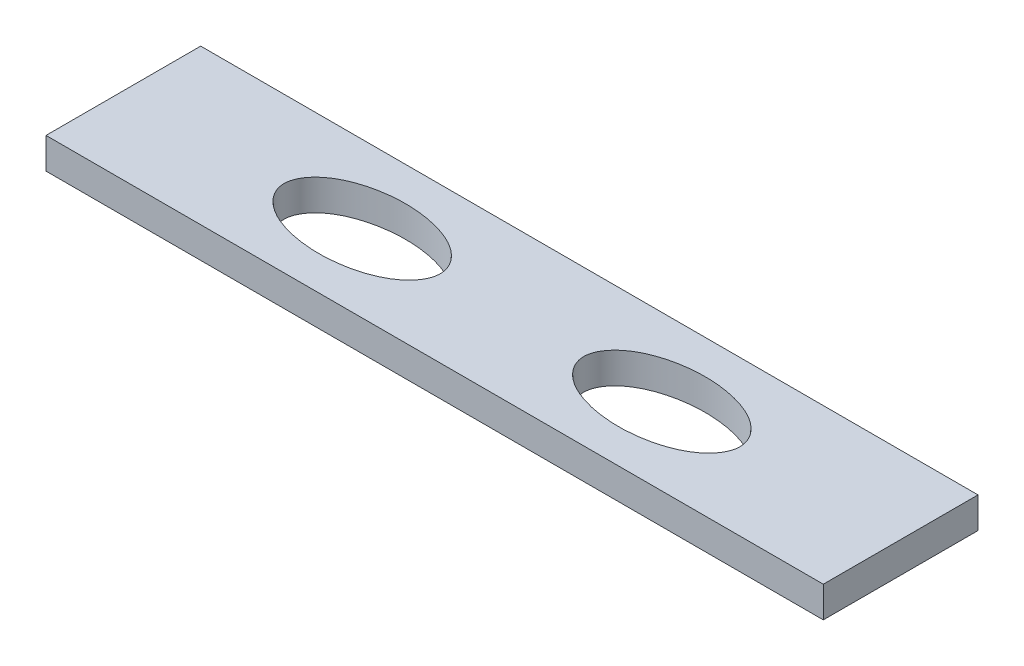
ISO-10303-21;
HEADER;
FILE_DESCRIPTION(('STEP AP214'),'2;1');
FILE_NAME('part.step','',(''),(''),'','','');
FILE_SCHEMA(('AUTOMOTIVE_DESIGN { 1 0 10303 214 1 1 1 1 }'));
ENDSEC;
DATA;
#1=APPLICATION_CONTEXT('core data for automotive mechanical design processes');
#2=APPLICATION_PROTOCOL_DEFINITION('international standard','automotive_design',2000,#1);
#3=PRODUCT_CONTEXT('',#1,'mechanical');
#4=PRODUCT('Part','Part','',(#3));
#5=PRODUCT_RELATED_PRODUCT_CATEGORY('part','',(#4));
#6=PRODUCT_DEFINITION_FORMATION('','',#4);
#7=PRODUCT_DEFINITION_CONTEXT('part definition',#1,'design');
#8=PRODUCT_DEFINITION('design','',#6,#7);
#9=PRODUCT_DEFINITION_SHAPE('','',#8);
#10=(LENGTH_UNIT() NAMED_UNIT(*) SI_UNIT(.MILLI.,.METRE.));
#11=(NAMED_UNIT(*) PLANE_ANGLE_UNIT() SI_UNIT($,.RADIAN.));
#12=(NAMED_UNIT(*) SI_UNIT($,.STERADIAN.) SOLID_ANGLE_UNIT());
#13=UNCERTAINTY_MEASURE_WITH_UNIT(LENGTH_MEASURE(1.E-05),#10,'distance_accuracy_value','');
#14=(GEOMETRIC_REPRESENTATION_CONTEXT(3) GLOBAL_UNCERTAINTY_ASSIGNED_CONTEXT((#13)) GLOBAL_UNIT_ASSIGNED_CONTEXT((#10,
#11,#12)) REPRESENTATION_CONTEXT('',''));
#15=CARTESIAN_POINT('',(0.,0.,0.));
#16=DIRECTION('',(0.,0.,1.));
#17=DIRECTION('',(1.,0.,0.));
#18=AXIS2_PLACEMENT_3D('',#15,#16,#17);
#19=CARTESIAN_POINT('',(0.,2.,0.));
#20=DIRECTION('',(0.,1.,0.));
#21=DIRECTION('',(0.,0.,1.));
#22=AXIS2_PLACEMENT_3D('',#19,#20,#21);
#23=PLANE('',#22);
#24=CARTESIAN_POINT('',(-27.8155454545455,2.,-1.78030303030303));
#25=CARTESIAN_POINT('',(-27.8155454545455,2.,-1.04410049104769));
#26=CARTESIAN_POINT('',(-26.703482328982,2.,0.428304587462979));
#27=CARTESIAN_POINT('',(-22.7655454545455,2.,1.31539316081397));
#28=CARTESIAN_POINT('',(-18.8276085801089,2.,0.428304587462979));
#29=CARTESIAN_POINT('',(-17.1595138917637,2.,-1.78030303030303));
#30=CARTESIAN_POINT('',(-18.8276085801088,2.,-3.98891064806904));
#31=CARTESIAN_POINT('',(-22.7655454545455,2.,-4.87599922142003));
#32=CARTESIAN_POINT('',(-26.703482328982,2.,-3.98891064806904));
#33=CARTESIAN_POINT('',(-27.8155454545455,2.,-2.51650556955837));
#34=CARTESIAN_POINT('',(-27.8155454545455,2.,-1.78030303030303));
#35=B_SPLINE_CURVE_WITH_KNOTS('',3,(#24,#25,#26,#27,#28,#29,#30,#31,#32,#33,#34),.UNSPECIFIED.,
.T.,.F.,(4,1,1,1,1,1,1,1,4),(0.,0.785398163397448,1.5707963267949,2.35619449019234,
3.14159265358979,3.92699081698724,4.71238898038469,5.49778714378214,6.28318530717959),.UNSPECIFIED.);
#36=CARTESIAN_POINT('',(-27.8155454545455,2.,-1.78030303030303));
#37=VERTEX_POINT('',#36);
#38=EDGE_CURVE('E102',#37,#37,#35,.T.);
#39=ORIENTED_EDGE('',*,*,#38,.F.);
#40=EDGE_LOOP('',(#39));
#41=FACE_BOUND('',#40,.T.);
#42=DIRECTION('',(0.,0.,-1.));
#43=VECTOR('',#42,1.);
#44=CARTESIAN_POINT('',(12.0454545454546,2.,-6.78030303030303));
#45=LINE('',#44,#43);
#46=CARTESIAN_POINT('',(12.0454545454546,2.,3.21969696969697));
#47=VERTEX_POINT('',#46);
#48=CARTESIAN_POINT('',(12.0454545454546,2.,-6.78030303030303));
#49=VERTEX_POINT('',#48);
#50=EDGE_CURVE('E87',#47,#49,#45,.T.);
#51=ORIENTED_EDGE('',*,*,#50,.T.);
#52=DIRECTION('',(-1.,0.,0.));
#53=VECTOR('',#52,1.);
#54=CARTESIAN_POINT('',(-38.2045454545454,2.,-6.78030303030303));
#55=LINE('',#54,#53);
#56=CARTESIAN_POINT('',(-38.2045454545454,2.,-6.78030303030303));
#57=VERTEX_POINT('',#56);
#58=EDGE_CURVE('E82',#49,#57,#55,.T.);
#59=ORIENTED_EDGE('',*,*,#58,.T.);
#60=DIRECTION('',(0.,0.,1.));
#61=VECTOR('',#60,1.);
#62=CARTESIAN_POINT('',(-38.2045454545454,2.,-6.78030303030303));
#63=LINE('',#62,#61);
#64=CARTESIAN_POINT('',(-38.2045454545454,2.,3.21969696969697));
#65=VERTEX_POINT('',#64);
#66=EDGE_CURVE('E85',#57,#65,#63,.T.);
#67=ORIENTED_EDGE('',*,*,#66,.T.);
#68=DIRECTION('',(1.,0.,0.));
#69=VECTOR('',#68,1.);
#70=CARTESIAN_POINT('',(-38.2045454545454,2.,3.21969696969697));
#71=LINE('',#70,#69);
#72=EDGE_CURVE('E52',#65,#47,#71,.T.);
#73=ORIENTED_EDGE('',*,*,#72,.T.);
#74=EDGE_LOOP('',(#51,#59,#67,#73));
#75=FACE_BOUND('',#74,.T.);
#76=CARTESIAN_POINT('',(-8.44354545454545,2.,-1.78030303030303));
#77=CARTESIAN_POINT('',(-8.44354545454545,2.,-1.04410049104769));
#78=CARTESIAN_POINT('',(-7.33148232898204,2.,0.428304587462979));
#79=CARTESIAN_POINT('',(-3.39354545454545,2.,1.31539316081397));
#80=CARTESIAN_POINT('',(0.544391419891147,2.,0.428304587462979));
#81=CARTESIAN_POINT('',(2.21248610823626,2.,-1.78030303030303));
#82=CARTESIAN_POINT('',(0.544391419891149,2.,-3.98891064806904));
#83=CARTESIAN_POINT('',(-3.39354545454545,2.,-4.87599922142003));
#84=CARTESIAN_POINT('',(-7.33148232898204,2.,-3.98891064806904));
#85=CARTESIAN_POINT('',(-8.44354545454545,2.,-2.51650556955837));
#86=CARTESIAN_POINT('',(-8.44354545454545,2.,-1.78030303030303));
#87=B_SPLINE_CURVE_WITH_KNOTS('',3,(#76,#77,#78,#79,#80,#81,#82,#83,#84,#85,#86),.UNSPECIFIED.,
.T.,.F.,(4,1,1,1,1,1,1,1,4),(0.,0.785398163397448,1.5707963267949,2.35619449019234,
3.14159265358979,3.92699081698724,4.71238898038469,5.49778714378214,6.28318530717959),.UNSPECIFIED.);
#88=CARTESIAN_POINT('',(-8.44354545454545,2.,-1.78030303030303));
#89=VERTEX_POINT('',#88);
#90=EDGE_CURVE('E119',#89,#89,#87,.T.);
#91=ORIENTED_EDGE('',*,*,#90,.F.);
#92=EDGE_LOOP('',(#91));
#93=FACE_BOUND('',#92,.T.);
#94=ADVANCED_FACE('F35',(#41,#75,#93),#23,.T.);
#95=CARTESIAN_POINT('',(0.,0.,0.));
#96=DIRECTION('',(0.,1.,0.));
#97=DIRECTION('',(0.,0.,1.));
#98=AXIS2_PLACEMENT_3D('',#95,#96,#97);
#99=PLANE('',#98);
#100=DIRECTION('',(0.,0.,-1.));
#101=VECTOR('',#100,1.);
#102=CARTESIAN_POINT('',(12.0454545454546,0.,-6.78030303030303));
#103=LINE('',#102,#101);
#104=CARTESIAN_POINT('',(12.0454545454546,0.,3.21969696969697));
#105=VERTEX_POINT('',#104);
#106=CARTESIAN_POINT('',(12.0454545454546,0.,-6.78030303030303));
#107=VERTEX_POINT('',#106);
#108=EDGE_CURVE('E99',#105,#107,#103,.T.);
#109=ORIENTED_EDGE('',*,*,#108,.F.);
#110=DIRECTION('',(1.,0.,0.));
#111=VECTOR('',#110,1.);
#112=CARTESIAN_POINT('',(-38.2045454545454,0.,3.21969696969697));
#113=LINE('',#112,#111);
#114=CARTESIAN_POINT('',(-38.2045454545454,0.,3.21969696969697));
#115=VERTEX_POINT('',#114);
#116=EDGE_CURVE('E75',#115,#105,#113,.T.);
#117=ORIENTED_EDGE('',*,*,#116,.F.);
#118=DIRECTION('',(0.,0.,1.));
#119=VECTOR('',#118,1.);
#120=CARTESIAN_POINT('',(-38.2045454545454,0.,-6.78030303030303));
#121=LINE('',#120,#119);
#122=CARTESIAN_POINT('',(-38.2045454545454,0.,-6.78030303030303));
#123=VERTEX_POINT('',#122);
#124=EDGE_CURVE('E69',#123,#115,#121,.T.);
#125=ORIENTED_EDGE('',*,*,#124,.F.);
#126=DIRECTION('',(-1.,0.,0.));
#127=VECTOR('',#126,1.);
#128=CARTESIAN_POINT('',(-38.2045454545454,0.,-6.78030303030303));
#129=LINE('',#128,#127);
#130=EDGE_CURVE('E91',#107,#123,#129,.T.);
#131=ORIENTED_EDGE('',*,*,#130,.F.);
#132=EDGE_LOOP('',(#109,#117,#125,#131));
#133=FACE_BOUND('',#132,.T.);
#134=CARTESIAN_POINT('',(-27.8155454545455,0.,-1.78030303030303));
#135=CARTESIAN_POINT('',(-27.8155454545455,0.,-1.04410049104769));
#136=CARTESIAN_POINT('',(-26.703482328982,0.,0.428304587462979));
#137=CARTESIAN_POINT('',(-22.7655454545455,0.,1.31539316081397));
#138=CARTESIAN_POINT('',(-18.8276085801089,0.,0.428304587462979));
#139=CARTESIAN_POINT('',(-17.1595138917637,0.,-1.78030303030303));
#140=CARTESIAN_POINT('',(-18.8276085801088,0.,-3.98891064806904));
#141=CARTESIAN_POINT('',(-22.7655454545455,0.,-4.87599922142003));
#142=CARTESIAN_POINT('',(-26.703482328982,0.,-3.98891064806904));
#143=CARTESIAN_POINT('',(-27.8155454545455,0.,-2.51650556955837));
#144=CARTESIAN_POINT('',(-27.8155454545455,0.,-1.78030303030303));
#145=B_SPLINE_CURVE_WITH_KNOTS('',3,(#134,#135,#136,#137,#138,#139,#140,#141,#142,#143,#144),
.UNSPECIFIED.,.T.,.F.,(4,1,1,1,1,1,1,1,4),(0.,0.785398163397448,1.5707963267949,
2.35619449019234,3.14159265358979,3.92699081698724,4.71238898038469,5.49778714378214,
6.28318530717959),.UNSPECIFIED.);
#146=CARTESIAN_POINT('',(-27.8155454545455,0.,-1.78030303030303));
#147=VERTEX_POINT('',#146);
#148=EDGE_CURVE('E114',#147,#147,#145,.T.);
#149=ORIENTED_EDGE('',*,*,#148,.T.);
#150=EDGE_LOOP('',(#149));
#151=FACE_BOUND('',#150,.T.);
#152=CARTESIAN_POINT('',(-8.44354545454545,0.,-1.78030303030303));
#153=CARTESIAN_POINT('',(-8.44354545454545,0.,-1.04410049104769));
#154=CARTESIAN_POINT('',(-7.33148232898204,0.,0.428304587462979));
#155=CARTESIAN_POINT('',(-3.39354545454545,0.,1.31539316081397));
#156=CARTESIAN_POINT('',(0.544391419891147,0.,0.428304587462979));
#157=CARTESIAN_POINT('',(2.21248610823626,0.,-1.78030303030303));
#158=CARTESIAN_POINT('',(0.544391419891149,0.,-3.98891064806904));
#159=CARTESIAN_POINT('',(-3.39354545454545,0.,-4.87599922142003));
#160=CARTESIAN_POINT('',(-7.33148232898204,0.,-3.98891064806904));
#161=CARTESIAN_POINT('',(-8.44354545454545,0.,-2.51650556955837));
#162=CARTESIAN_POINT('',(-8.44354545454545,0.,-1.78030303030303));
#163=B_SPLINE_CURVE_WITH_KNOTS('',3,(#152,#153,#154,#155,#156,#157,#158,#159,#160,#161,#162),
.UNSPECIFIED.,.T.,.F.,(4,1,1,1,1,1,1,1,4),(0.,0.785398163397448,1.5707963267949,
2.35619449019234,3.14159265358979,3.92699081698724,4.71238898038469,5.49778714378214,
6.28318530717959),.UNSPECIFIED.);
#164=CARTESIAN_POINT('',(-8.44354545454545,0.,-1.78030303030303));
#165=VERTEX_POINT('',#164);
#166=EDGE_CURVE('E128',#165,#165,#163,.T.);
#167=ORIENTED_EDGE('',*,*,#166,.T.);
#168=EDGE_LOOP('',(#167));
#169=FACE_BOUND('',#168,.T.);
#170=ADVANCED_FACE('F110',(#133,#151,#169),#99,.F.);
#171=CARTESIAN_POINT('',(12.0454545454546,2.,-6.78030303030303));
#172=DIRECTION('',(-1.,0.,0.));
#173=DIRECTION('',(0.,0.,1.));
#174=AXIS2_PLACEMENT_3D('',#171,#172,#173);
#175=PLANE('',#174);
#176=ORIENTED_EDGE('',*,*,#108,.T.);
#177=DIRECTION('',(0.,-1.,0.));
#178=VECTOR('',#177,1.);
#179=CARTESIAN_POINT('',(12.0454545454546,2.,-6.78030303030303));
#180=LINE('',#179,#178);
#181=EDGE_CURVE('E11',#49,#107,#180,.T.);
#182=ORIENTED_EDGE('',*,*,#181,.F.);
#183=ORIENTED_EDGE('',*,*,#50,.F.);
#184=DIRECTION('',(0.,-1.,0.));
#185=VECTOR('',#184,1.);
#186=CARTESIAN_POINT('',(12.0454545454546,2.,3.21969696969697));
#187=LINE('',#186,#185);
#188=EDGE_CURVE('E95',#47,#105,#187,.T.);
#189=ORIENTED_EDGE('',*,*,#188,.T.);
#190=EDGE_LOOP('',(#176,#182,#183,#189));
#191=FACE_BOUND('',#190,.T.);
#192=ADVANCED_FACE('F37',(#191),#175,.F.);
#193=CARTESIAN_POINT('',(-38.2045454545454,2.,-6.78030303030303));
#194=DIRECTION('',(0.,0.,1.));
#195=DIRECTION('',(1.,0.,0.));
#196=AXIS2_PLACEMENT_3D('',#193,#194,#195);
#197=PLANE('',#196);
#198=ORIENTED_EDGE('',*,*,#130,.T.);
#199=DIRECTION('',(0.,-1.,0.));
#200=VECTOR('',#199,1.);
#201=CARTESIAN_POINT('',(-38.2045454545454,2.,-6.78030303030303));
#202=LINE('',#201,#200);
#203=EDGE_CURVE('E44',#57,#123,#202,.T.);
#204=ORIENTED_EDGE('',*,*,#203,.F.);
#205=ORIENTED_EDGE('',*,*,#58,.F.);
#206=ORIENTED_EDGE('',*,*,#181,.T.);
#207=EDGE_LOOP('',(#198,#204,#205,#206));
#208=FACE_BOUND('',#207,.T.);
#209=ADVANCED_FACE('F90',(#208),#197,.F.);
#210=CARTESIAN_POINT('',(-38.2045454545454,2.,-6.78030303030303));
#211=DIRECTION('',(1.,0.,0.));
#212=DIRECTION('',(0.,0.,-1.));
#213=AXIS2_PLACEMENT_3D('',#210,#211,#212);
#214=PLANE('',#213);
#215=ORIENTED_EDGE('',*,*,#124,.T.);
#216=DIRECTION('',(0.,-1.,0.));
#217=VECTOR('',#216,1.);
#218=CARTESIAN_POINT('',(-38.2045454545454,2.,3.21969696969697));
#219=LINE('',#218,#217);
#220=EDGE_CURVE('E92',#65,#115,#219,.T.);
#221=ORIENTED_EDGE('',*,*,#220,.F.);
#222=ORIENTED_EDGE('',*,*,#66,.F.);
#223=ORIENTED_EDGE('',*,*,#203,.T.);
#224=EDGE_LOOP('',(#215,#221,#222,#223));
#225=FACE_BOUND('',#224,.T.);
#226=ADVANCED_FACE('F93',(#225),#214,.F.);
#227=CARTESIAN_POINT('',(-38.2045454545454,2.,3.21969696969697));
#228=DIRECTION('',(0.,0.,-1.));
#229=DIRECTION('',(-1.,0.,0.));
#230=AXIS2_PLACEMENT_3D('',#227,#228,#229);
#231=PLANE('',#230);
#232=ORIENTED_EDGE('',*,*,#116,.T.);
#233=ORIENTED_EDGE('',*,*,#188,.F.);
#234=ORIENTED_EDGE('',*,*,#72,.F.);
#235=ORIENTED_EDGE('',*,*,#220,.T.);
#236=EDGE_LOOP('',(#232,#233,#234,#235));
#237=FACE_BOUND('',#236,.T.);
#238=ADVANCED_FACE('F107',(#237),#231,.F.);
#239=DIRECTION('',(0.,-1.,0.));
#240=VECTOR('',#239,1.);
#241=SURFACE_OF_LINEAR_EXTRUSION('',#35,#240);
#242=ORIENTED_EDGE('',*,*,#38,.T.);
#243=EDGE_LOOP('',(#242));
#244=FACE_BOUND('',#243,.T.);
#245=ORIENTED_EDGE('',*,*,#148,.F.);
#246=EDGE_LOOP('',(#245));
#247=FACE_BOUND('',#246,.T.);
#248=ADVANCED_FACE('F136',(#244,#247),#241,.T.);
#249=DIRECTION('',(0.,-1.,0.));
#250=VECTOR('',#249,1.);
#251=SURFACE_OF_LINEAR_EXTRUSION('',#87,#250);
#252=ORIENTED_EDGE('',*,*,#90,.T.);
#253=EDGE_LOOP('',(#252));
#254=FACE_BOUND('',#253,.T.);
#255=ORIENTED_EDGE('',*,*,#166,.F.);
#256=EDGE_LOOP('',(#255));
#257=FACE_BOUND('',#256,.T.);
#258=ADVANCED_FACE('F140',(#254,#257),#251,.T.);
#259=CLOSED_SHELL('',(#94,#170,#192,#209,#226,#238,#248,#258));
#260=MANIFOLD_SOLID_BREP('B2',#259);
#261=ADVANCED_BREP_SHAPE_REPRESENTATION('',(#18,#260),#14);
#262=SHAPE_DEFINITION_REPRESENTATION(#9,#261);
ENDSEC;
END-ISO-10303-21;
